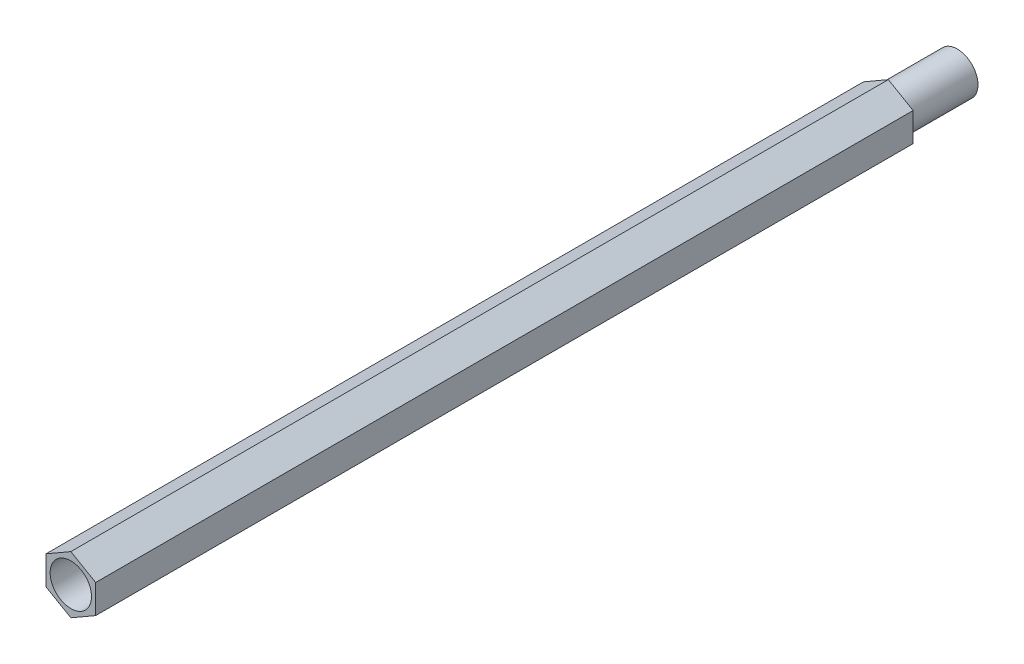
ISO-10303-21;
HEADER;
FILE_DESCRIPTION(('STEP AP214'),'2;1');
FILE_NAME('part.step','',(''),(''),'','','');
FILE_SCHEMA(('AUTOMOTIVE_DESIGN { 1 0 10303 214 1 1 1 1 }'));
ENDSEC;
DATA;
#1=APPLICATION_CONTEXT('core data for automotive mechanical design processes');
#2=APPLICATION_PROTOCOL_DEFINITION('international standard','automotive_design',2000,#1);
#3=PRODUCT_CONTEXT('',#1,'mechanical');
#4=PRODUCT('Part','Part','',(#3));
#5=PRODUCT_RELATED_PRODUCT_CATEGORY('part','',(#4));
#6=PRODUCT_DEFINITION_FORMATION('','',#4);
#7=PRODUCT_DEFINITION_CONTEXT('part definition',#1,'design');
#8=PRODUCT_DEFINITION('design','',#6,#7);
#9=PRODUCT_DEFINITION_SHAPE('','',#8);
#10=(LENGTH_UNIT() NAMED_UNIT(*) SI_UNIT(.MILLI.,.METRE.));
#11=(NAMED_UNIT(*) PLANE_ANGLE_UNIT() SI_UNIT($,.RADIAN.));
#12=(NAMED_UNIT(*) SI_UNIT($,.STERADIAN.) SOLID_ANGLE_UNIT());
#13=UNCERTAINTY_MEASURE_WITH_UNIT(LENGTH_MEASURE(1.E-05),#10,'distance_accuracy_value','');
#14=(GEOMETRIC_REPRESENTATION_CONTEXT(3) GLOBAL_UNCERTAINTY_ASSIGNED_CONTEXT((#13)) GLOBAL_UNIT_ASSIGNED_CONTEXT((#10,
#11,#12)) REPRESENTATION_CONTEXT('',''));
#15=CARTESIAN_POINT('',(0.,0.,0.));
#16=DIRECTION('',(0.,0.,1.));
#17=DIRECTION('',(1.,0.,0.));
#18=AXIS2_PLACEMENT_3D('',#15,#16,#17);
#19=CARTESIAN_POINT('',(0.,0.,59.25));
#20=DIRECTION('',(0.,0.,-1.));
#21=DIRECTION('',(-1.,0.,0.));
#22=AXIS2_PLACEMENT_3D('',#19,#20,#21);
#23=CYLINDRICAL_SURFACE('',#22,1.5);
#24=CARTESIAN_POINT('',(0.,0.,59.25));
#25=DIRECTION('',(0.,0.,1.));
#26=DIRECTION('',(1.,0.,0.));
#27=AXIS2_PLACEMENT_3D('',#24,#25,#26);
#28=CIRCLE('',#27,1.5);
#29=CARTESIAN_POINT('',(1.5,0.,59.25));
#30=VERTEX_POINT('',#29);
#31=EDGE_CURVE('E141',#30,#30,#28,.T.);
#32=ORIENTED_EDGE('',*,*,#31,.T.);
#33=EDGE_LOOP('',(#32));
#34=FACE_BOUND('',#33,.T.);
#35=CARTESIAN_POINT('',(0.,0.,5.));
#36=DIRECTION('',(0.,0.,-1.));
#37=DIRECTION('',(-1.,0.,0.));
#38=AXIS2_PLACEMENT_3D('',#35,#36,#37);
#39=CIRCLE('',#38,1.5);
#40=CARTESIAN_POINT('',(-1.5,0.,5.));
#41=VERTEX_POINT('',#40);
#42=EDGE_CURVE('E258',#41,#41,#39,.T.);
#43=ORIENTED_EDGE('',*,*,#42,.T.);
#44=EDGE_LOOP('',(#43));
#45=FACE_BOUND('',#44,.T.);
#46=ADVANCED_FACE('F45',(#34,#45),#23,.F.);
#47=CARTESIAN_POINT('',(0.,0.,59.25));
#48=DIRECTION('',(0.,0.,1.));
#49=DIRECTION('',(1.,0.,0.));
#50=AXIS2_PLACEMENT_3D('',#47,#48,#49);
#51=PLANE('',#50);
#52=DIRECTION('',(-0.866025403784439,0.5,0.));
#53=VECTOR('',#52,1.);
#54=CARTESIAN_POINT('',(1.8,1.03923048454133,59.25));
#55=LINE('',#54,#53);
#56=CARTESIAN_POINT('',(1.8,1.03923048454133,59.25));
#57=VERTEX_POINT('',#56);
#58=CARTESIAN_POINT('',(0.,2.07846096908265,59.25));
#59=VERTEX_POINT('',#58);
#60=EDGE_CURVE('E153',#57,#59,#55,.T.);
#61=ORIENTED_EDGE('',*,*,#60,.T.);
#62=DIRECTION('',(-0.866025403784439,-0.5,0.));
#63=VECTOR('',#62,1.);
#64=CARTESIAN_POINT('',(0.,2.07846096908265,59.25));
#65=LINE('',#64,#63);
#66=CARTESIAN_POINT('',(-1.8,1.03923048454133,59.25));
#67=VERTEX_POINT('',#66);
#68=EDGE_CURVE('E100',#59,#67,#65,.T.);
#69=ORIENTED_EDGE('',*,*,#68,.T.);
#70=DIRECTION('',(0.,-1.,0.));
#71=VECTOR('',#70,1.);
#72=CARTESIAN_POINT('',(-1.8,1.03923048454133,59.25));
#73=LINE('',#72,#71);
#74=CARTESIAN_POINT('',(-1.8,-1.03923048454133,59.25));
#75=VERTEX_POINT('',#74);
#76=EDGE_CURVE('E114',#67,#75,#73,.T.);
#77=ORIENTED_EDGE('',*,*,#76,.T.);
#78=DIRECTION('',(0.866025403784439,-0.5,0.));
#79=VECTOR('',#78,1.);
#80=CARTESIAN_POINT('',(-1.8,-1.03923048454133,59.25));
#81=LINE('',#80,#79);
#82=CARTESIAN_POINT('',(0.,-2.07846096908265,59.25));
#83=VERTEX_POINT('',#82);
#84=EDGE_CURVE('E107',#75,#83,#81,.T.);
#85=ORIENTED_EDGE('',*,*,#84,.T.);
#86=DIRECTION('',(0.866025403784439,0.5,0.));
#87=VECTOR('',#86,1.);
#88=CARTESIAN_POINT('',(0.,-2.07846096908265,59.25));
#89=LINE('',#88,#87);
#90=CARTESIAN_POINT('',(1.8,-1.03923048454133,59.25));
#91=VERTEX_POINT('',#90);
#92=EDGE_CURVE('E112',#83,#91,#89,.T.);
#93=ORIENTED_EDGE('',*,*,#92,.T.);
#94=DIRECTION('',(0.,1.,0.));
#95=VECTOR('',#94,1.);
#96=CARTESIAN_POINT('',(1.8,-1.03923048454133,59.25));
#97=LINE('',#96,#95);
#98=EDGE_CURVE('E63',#91,#57,#97,.T.);
#99=ORIENTED_EDGE('',*,*,#98,.T.);
#100=EDGE_LOOP('',(#61,#69,#77,#85,#93,#99));
#101=FACE_BOUND('',#100,.T.);
#102=ORIENTED_EDGE('',*,*,#31,.F.);
#103=EDGE_LOOP('',(#102));
#104=FACE_BOUND('',#103,.T.);
#105=ADVANCED_FACE('F109',(#101,#104),#51,.T.);
#106=CARTESIAN_POINT('',(0.,0.,0.));
#107=DIRECTION('',(0.,0.,1.));
#108=DIRECTION('',(1.,0.,0.));
#109=AXIS2_PLACEMENT_3D('',#106,#107,#108);
#110=PLANE('',#109);
#111=DIRECTION('',(-0.866025403784439,0.5,0.));
#112=VECTOR('',#111,1.);
#113=CARTESIAN_POINT('',(1.8,1.03923048454133,0.));
#114=LINE('',#113,#112);
#115=CARTESIAN_POINT('',(1.8,1.03923048454133,0.));
#116=VERTEX_POINT('',#115);
#117=CARTESIAN_POINT('',(0.,2.07846096908265,0.));
#118=VERTEX_POINT('',#117);
#119=EDGE_CURVE('E136',#116,#118,#114,.T.);
#120=ORIENTED_EDGE('',*,*,#119,.F.);
#121=DIRECTION('',(0.,1.,0.));
#122=VECTOR('',#121,1.);
#123=CARTESIAN_POINT('',(1.8,-1.03923048454133,0.));
#124=LINE('',#123,#122);
#125=CARTESIAN_POINT('',(1.8,-1.03923048454133,0.));
#126=VERTEX_POINT('',#125);
#127=EDGE_CURVE('E92',#126,#116,#124,.T.);
#128=ORIENTED_EDGE('',*,*,#127,.F.);
#129=DIRECTION('',(0.866025403784439,0.5,0.));
#130=VECTOR('',#129,1.);
#131=CARTESIAN_POINT('',(0.,-2.07846096908265,0.));
#132=LINE('',#131,#130);
#133=CARTESIAN_POINT('',(0.,-2.07846096908265,0.));
#134=VERTEX_POINT('',#133);
#135=EDGE_CURVE('E86',#134,#126,#132,.T.);
#136=ORIENTED_EDGE('',*,*,#135,.F.);
#137=DIRECTION('',(0.866025403784439,-0.5,0.));
#138=VECTOR('',#137,1.);
#139=CARTESIAN_POINT('',(-1.8,-1.03923048454133,0.));
#140=LINE('',#139,#138);
#141=CARTESIAN_POINT('',(-1.8,-1.03923048454133,0.));
#142=VERTEX_POINT('',#141);
#143=EDGE_CURVE('E123',#142,#134,#140,.T.);
#144=ORIENTED_EDGE('',*,*,#143,.F.);
#145=DIRECTION('',(0.,-1.,0.));
#146=VECTOR('',#145,1.);
#147=CARTESIAN_POINT('',(-1.8,1.03923048454133,0.));
#148=LINE('',#147,#146);
#149=CARTESIAN_POINT('',(-1.8,1.03923048454133,0.));
#150=VERTEX_POINT('',#149);
#151=EDGE_CURVE('E144',#150,#142,#148,.T.);
#152=ORIENTED_EDGE('',*,*,#151,.F.);
#153=DIRECTION('',(-0.866025403784439,-0.5,0.));
#154=VECTOR('',#153,1.);
#155=CARTESIAN_POINT('',(0.,2.07846096908265,0.));
#156=LINE('',#155,#154);
#157=EDGE_CURVE('E140',#118,#150,#156,.T.);
#158=ORIENTED_EDGE('',*,*,#157,.F.);
#159=EDGE_LOOP('',(#120,#128,#136,#144,#152,#158));
#160=FACE_BOUND('',#159,.T.);
#161=CARTESIAN_POINT('',(0.,0.,0.));
#162=DIRECTION('',(0.,0.,1.));
#163=DIRECTION('',(1.,0.,0.));
#164=AXIS2_PLACEMENT_3D('',#161,#162,#163);
#165=CIRCLE('',#164,1.5);
#166=CARTESIAN_POINT('',(1.5,0.,0.));
#167=VERTEX_POINT('',#166);
#168=EDGE_CURVE('E257',#167,#167,#165,.F.);
#169=ORIENTED_EDGE('',*,*,#168,.F.);
#170=EDGE_LOOP('',(#169));
#171=FACE_BOUND('',#170,.T.);
#172=ADVANCED_FACE('F166',(#160,#171),#110,.F.);
#173=CARTESIAN_POINT('',(1.8,1.03923048454133,59.25));
#174=DIRECTION('',(-0.5,-0.866025403784439,0.));
#175=DIRECTION('',(0.866025403784439,-0.5,0.));
#176=AXIS2_PLACEMENT_3D('',#173,#174,#175);
#177=PLANE('',#176);
#178=ORIENTED_EDGE('',*,*,#119,.T.);
#179=DIRECTION('',(0.,0.,-1.));
#180=VECTOR('',#179,1.);
#181=CARTESIAN_POINT('',(0.,2.07846096908265,59.25));
#182=LINE('',#181,#180);
#183=EDGE_CURVE('E11',#59,#118,#182,.T.);
#184=ORIENTED_EDGE('',*,*,#183,.F.);
#185=ORIENTED_EDGE('',*,*,#60,.F.);
#186=DIRECTION('',(0.,0.,-1.));
#187=VECTOR('',#186,1.);
#188=CARTESIAN_POINT('',(1.8,1.03923048454133,59.25));
#189=LINE('',#188,#187);
#190=EDGE_CURVE('E132',#57,#116,#189,.T.);
#191=ORIENTED_EDGE('',*,*,#190,.T.);
#192=EDGE_LOOP('',(#178,#184,#185,#191));
#193=FACE_BOUND('',#192,.T.);
#194=ADVANCED_FACE('F47',(#193),#177,.F.);
#195=CARTESIAN_POINT('',(0.,2.07846096908265,59.25));
#196=DIRECTION('',(0.5,-0.866025403784439,0.));
#197=DIRECTION('',(0.866025403784439,0.5,0.));
#198=AXIS2_PLACEMENT_3D('',#195,#196,#197);
#199=PLANE('',#198);
#200=ORIENTED_EDGE('',*,*,#157,.T.);
#201=DIRECTION('',(0.,0.,-1.));
#202=VECTOR('',#201,1.);
#203=CARTESIAN_POINT('',(-1.8,1.03923048454133,59.25));
#204=LINE('',#203,#202);
#205=EDGE_CURVE('E55',#67,#150,#204,.T.);
#206=ORIENTED_EDGE('',*,*,#205,.F.);
#207=ORIENTED_EDGE('',*,*,#68,.F.);
#208=ORIENTED_EDGE('',*,*,#183,.T.);
#209=EDGE_LOOP('',(#200,#206,#207,#208));
#210=FACE_BOUND('',#209,.T.);
#211=ADVANCED_FACE('F198',(#210),#199,.F.);
#212=CARTESIAN_POINT('',(-1.8,1.03923048454133,59.25));
#213=DIRECTION('',(1.,0.,0.));
#214=DIRECTION('',(0.,1.,0.));
#215=AXIS2_PLACEMENT_3D('',#212,#213,#214);
#216=PLANE('',#215);
#217=ORIENTED_EDGE('',*,*,#151,.T.);
#218=DIRECTION('',(0.,0.,-1.));
#219=VECTOR('',#218,1.);
#220=CARTESIAN_POINT('',(-1.8,-1.03923048454133,59.25));
#221=LINE('',#220,#219);
#222=EDGE_CURVE('E125',#75,#142,#221,.T.);
#223=ORIENTED_EDGE('',*,*,#222,.F.);
#224=ORIENTED_EDGE('',*,*,#76,.F.);
#225=ORIENTED_EDGE('',*,*,#205,.T.);
#226=EDGE_LOOP('',(#217,#223,#224,#225));
#227=FACE_BOUND('',#226,.T.);
#228=ADVANCED_FACE('F163',(#227),#216,.F.);
#229=CARTESIAN_POINT('',(-1.8,-1.03923048454133,59.25));
#230=DIRECTION('',(0.5,0.866025403784439,0.));
#231=DIRECTION('',(-0.866025403784439,0.5,0.));
#232=AXIS2_PLACEMENT_3D('',#229,#230,#231);
#233=PLANE('',#232);
#234=ORIENTED_EDGE('',*,*,#143,.T.);
#235=DIRECTION('',(0.,0.,-1.));
#236=VECTOR('',#235,1.);
#237=CARTESIAN_POINT('',(0.,-2.07846096908265,59.25));
#238=LINE('',#237,#236);
#239=EDGE_CURVE('E120',#83,#134,#238,.T.);
#240=ORIENTED_EDGE('',*,*,#239,.F.);
#241=ORIENTED_EDGE('',*,*,#84,.F.);
#242=ORIENTED_EDGE('',*,*,#222,.T.);
#243=EDGE_LOOP('',(#234,#240,#241,#242));
#244=FACE_BOUND('',#243,.T.);
#245=ADVANCED_FACE('F121',(#244),#233,.F.);
#246=CARTESIAN_POINT('',(0.,-2.07846096908265,59.25));
#247=DIRECTION('',(-0.5,0.866025403784439,0.));
#248=DIRECTION('',(-0.866025403784439,-0.5,0.));
#249=AXIS2_PLACEMENT_3D('',#246,#247,#248);
#250=PLANE('',#249);
#251=ORIENTED_EDGE('',*,*,#135,.T.);
#252=DIRECTION('',(0.,0.,-1.));
#253=VECTOR('',#252,1.);
#254=CARTESIAN_POINT('',(1.8,-1.03923048454133,59.25));
#255=LINE('',#254,#253);
#256=EDGE_CURVE('E126',#91,#126,#255,.T.);
#257=ORIENTED_EDGE('',*,*,#256,.F.);
#258=ORIENTED_EDGE('',*,*,#92,.F.);
#259=ORIENTED_EDGE('',*,*,#239,.T.);
#260=EDGE_LOOP('',(#251,#257,#258,#259));
#261=FACE_BOUND('',#260,.T.);
#262=ADVANCED_FACE('F128',(#261),#250,.F.);
#263=CARTESIAN_POINT('',(1.8,-1.03923048454133,59.25));
#264=DIRECTION('',(-1.,0.,0.));
#265=DIRECTION('',(0.,-1.,0.));
#266=AXIS2_PLACEMENT_3D('',#263,#264,#265);
#267=PLANE('',#266);
#268=ORIENTED_EDGE('',*,*,#127,.T.);
#269=ORIENTED_EDGE('',*,*,#190,.F.);
#270=ORIENTED_EDGE('',*,*,#98,.F.);
#271=ORIENTED_EDGE('',*,*,#256,.T.);
#272=EDGE_LOOP('',(#268,#269,#270,#271));
#273=FACE_BOUND('',#272,.T.);
#274=ADVANCED_FACE('F171',(#273),#267,.F.);
#275=CARTESIAN_POINT('',(0.,0.,5.));
#276=DIRECTION('',(0.,0.,-1.));
#277=DIRECTION('',(-1.,0.,0.));
#278=AXIS2_PLACEMENT_3D('',#275,#276,#277);
#279=PLANE('',#278);
#280=ORIENTED_EDGE('',*,*,#42,.F.);
#281=EDGE_LOOP('',(#280));
#282=FACE_BOUND('',#281,.T.);
#283=ADVANCED_FACE('F173',(#282),#279,.F.);
#284=CARTESIAN_POINT('',(0.,0.,-5.));
#285=DIRECTION('',(0.,0.,1.));
#286=DIRECTION('',(1.,0.,0.));
#287=AXIS2_PLACEMENT_3D('',#284,#285,#286);
#288=CYLINDRICAL_SURFACE('',#287,1.5);
#289=CARTESIAN_POINT('',(0.,0.,-5.));
#290=DIRECTION('',(0.,0.,-1.));
#291=DIRECTION('',(-1.,0.,0.));
#292=AXIS2_PLACEMENT_3D('',#289,#290,#291);
#293=CIRCLE('',#292,1.5);
#294=CARTESIAN_POINT('',(-1.5,0.,-5.));
#295=VERTEX_POINT('',#294);
#296=EDGE_CURVE('E255',#295,#295,#293,.T.);
#297=ORIENTED_EDGE('',*,*,#296,.F.);
#298=EDGE_LOOP('',(#297));
#299=FACE_BOUND('',#298,.T.);
#300=ORIENTED_EDGE('',*,*,#168,.T.);
#301=EDGE_LOOP('',(#300));
#302=FACE_BOUND('',#301,.T.);
#303=ADVANCED_FACE('F180',(#299,#302),#288,.T.);
#304=CARTESIAN_POINT('',(0.,0.,-5.));
#305=DIRECTION('',(0.,0.,-1.));
#306=DIRECTION('',(-1.,0.,0.));
#307=AXIS2_PLACEMENT_3D('',#304,#305,#306);
#308=PLANE('',#307);
#309=ORIENTED_EDGE('',*,*,#296,.T.);
#310=EDGE_LOOP('',(#309));
#311=FACE_BOUND('',#310,.T.);
#312=ADVANCED_FACE('F241',(#311),#308,.T.);
#313=CLOSED_SHELL('',(#46,#105,#172,#194,#211,#228,#245,#262,#274,#283,#303,#312));
#314=MANIFOLD_SOLID_BREP('B2',#313);
#315=ADVANCED_BREP_SHAPE_REPRESENTATION('',(#18,#314),#14);
#316=SHAPE_DEFINITION_REPRESENTATION(#9,#315);
ENDSEC;
END-ISO-10303-21;
